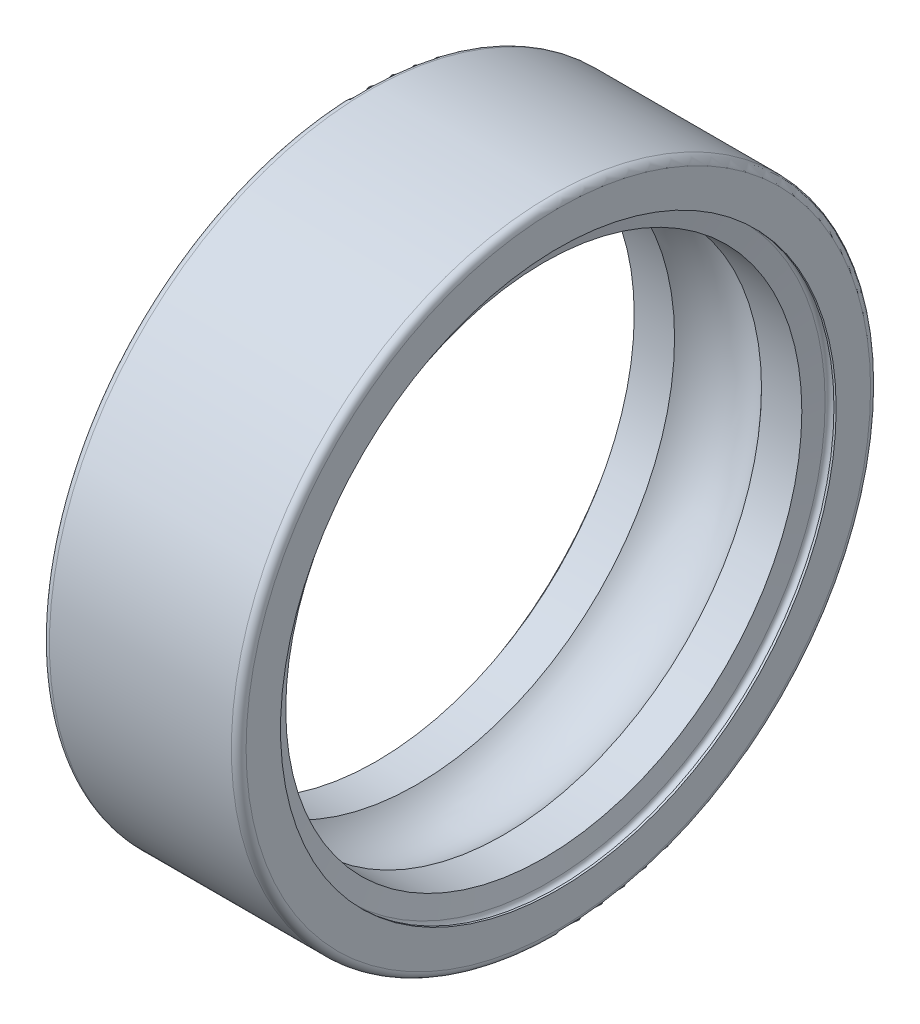
ISO-10303-21;
HEADER;
FILE_DESCRIPTION(('STEP AP214'),'2;1');
FILE_NAME('part.step','',(''),(''),'','','');
FILE_SCHEMA(('AUTOMOTIVE_DESIGN { 1 0 10303 214 1 1 1 1 }'));
ENDSEC;
DATA;
#1=APPLICATION_CONTEXT('core data for automotive mechanical design processes');
#2=APPLICATION_PROTOCOL_DEFINITION('international standard','automotive_design',2000,#1);
#3=PRODUCT_CONTEXT('',#1,'mechanical');
#4=PRODUCT('Part','Part','',(#3));
#5=PRODUCT_RELATED_PRODUCT_CATEGORY('part','',(#4));
#6=PRODUCT_DEFINITION_FORMATION('','',#4);
#7=PRODUCT_DEFINITION_CONTEXT('part definition',#1,'design');
#8=PRODUCT_DEFINITION('design','',#6,#7);
#9=PRODUCT_DEFINITION_SHAPE('','',#8);
#10=(LENGTH_UNIT() NAMED_UNIT(*) SI_UNIT(.MILLI.,.METRE.));
#11=(NAMED_UNIT(*) PLANE_ANGLE_UNIT() SI_UNIT($,.RADIAN.));
#12=(NAMED_UNIT(*) SI_UNIT($,.STERADIAN.) SOLID_ANGLE_UNIT());
#13=UNCERTAINTY_MEASURE_WITH_UNIT(LENGTH_MEASURE(1.E-05),#10,'distance_accuracy_value','');
#14=(GEOMETRIC_REPRESENTATION_CONTEXT(3) GLOBAL_UNCERTAINTY_ASSIGNED_CONTEXT((#13)) GLOBAL_UNIT_ASSIGNED_CONTEXT((#10,
#11,#12)) REPRESENTATION_CONTEXT('',''));
#15=CARTESIAN_POINT('',(0.,0.,0.));
#16=DIRECTION('',(0.,0.,1.));
#17=DIRECTION('',(1.,0.,0.));
#18=AXIS2_PLACEMENT_3D('',#15,#16,#17);
#19=CARTESIAN_POINT('',(0.3,0.,0.));
#20=DIRECTION('',(1.,0.,0.));
#21=DIRECTION('',(0.,0.,-1.));
#22=AXIS2_PLACEMENT_3D('',#19,#20,#21);
#23=TOROIDAL_SURFACE('',#22,12.7,0.3);
#24=CARTESIAN_POINT('',(0.,0.,0.));
#25=DIRECTION('',(1.,0.,0.));
#26=DIRECTION('',(0.,0.,-1.));
#27=AXIS2_PLACEMENT_3D('',#24,#25,#26);
#28=CIRCLE('',#27,12.7);
#29=CARTESIAN_POINT('',(0.,0.,-12.7));
#30=VERTEX_POINT('',#29);
#31=EDGE_CURVE('E10',#30,#30,#28,.T.);
#32=ORIENTED_EDGE('',*,*,#31,.T.);
#33=EDGE_LOOP('',(#32));
#34=FACE_BOUND('',#33,.T.);
#35=CARTESIAN_POINT('',(0.3,0.,0.));
#36=DIRECTION('',(1.,0.,0.));
#37=DIRECTION('',(0.,0.,-1.));
#38=AXIS2_PLACEMENT_3D('',#35,#36,#37);
#39=CIRCLE('',#38,13.);
#40=CARTESIAN_POINT('',(0.3,0.,-13.));
#41=VERTEX_POINT('',#40);
#42=EDGE_CURVE('E60',#41,#41,#39,.T.);
#43=ORIENTED_EDGE('',*,*,#42,.F.);
#44=EDGE_LOOP('',(#43));
#45=FACE_BOUND('',#44,.T.);
#46=ADVANCED_FACE('F14',(#34,#45),#23,.T.);
#47=CARTESIAN_POINT('',(0.,12.7,0.));
#48=DIRECTION('',(-1.,0.,0.));
#49=DIRECTION('',(0.,0.,1.));
#50=AXIS2_PLACEMENT_3D('',#47,#48,#49);
#51=PLANE('',#50);
#52=CARTESIAN_POINT('',(0.,0.,0.));
#53=DIRECTION('',(1.,0.,0.));
#54=DIRECTION('',(0.,0.,-1.));
#55=AXIS2_PLACEMENT_3D('',#52,#53,#54);
#56=CIRCLE('',#55,11.3);
#57=CARTESIAN_POINT('',(0.,0.,-11.3));
#58=VERTEX_POINT('',#57);
#59=EDGE_CURVE('E20',#58,#58,#56,.T.);
#60=ORIENTED_EDGE('',*,*,#59,.T.);
#61=EDGE_LOOP('',(#60));
#62=FACE_BOUND('',#61,.T.);
#63=ORIENTED_EDGE('',*,*,#31,.F.);
#64=EDGE_LOOP('',(#63));
#65=FACE_BOUND('',#64,.T.);
#66=ADVANCED_FACE('F68',(#62,#65),#51,.T.);
#67=CARTESIAN_POINT('',(50.,0.,0.));
#68=DIRECTION('',(1.,0.,0.));
#69=DIRECTION('',(0.,0.,-1.));
#70=AXIS2_PLACEMENT_3D('',#67,#68,#69);
#71=CYLINDRICAL_SURFACE('',#70,11.3);
#72=CARTESIAN_POINT('',(0.09,0.,0.));
#73=DIRECTION('',(1.,0.,0.));
#74=DIRECTION('',(0.,0.,-1.));
#75=AXIS2_PLACEMENT_3D('',#72,#73,#74);
#76=CIRCLE('',#75,11.3);
#77=CARTESIAN_POINT('',(0.09,0.,-11.3));
#78=VERTEX_POINT('',#77);
#79=EDGE_CURVE('E24',#78,#78,#76,.T.);
#80=ORIENTED_EDGE('',*,*,#79,.T.);
#81=EDGE_LOOP('',(#80));
#82=FACE_BOUND('',#81,.T.);
#83=ORIENTED_EDGE('',*,*,#59,.F.);
#84=EDGE_LOOP('',(#83));
#85=FACE_BOUND('',#84,.T.);
#86=ADVANCED_FACE('F73',(#82,#85),#71,.F.);
#87=CARTESIAN_POINT('',(0.27,0.,0.));
#88=DIRECTION('',(1.,0.,0.));
#89=DIRECTION('',(0.,0.,-1.));
#90=AXIS2_PLACEMENT_3D('',#87,#88,#89);
#91=TOROIDAL_SURFACE('',#90,11.3,0.18);
#92=ORIENTED_EDGE('',*,*,#79,.F.);
#93=EDGE_LOOP('',(#92));
#94=FACE_BOUND('',#93,.T.);
#95=CARTESIAN_POINT('',(0.45,0.,0.));
#96=DIRECTION('',(1.,0.,0.));
#97=DIRECTION('',(0.,0.,-1.));
#98=AXIS2_PLACEMENT_3D('',#95,#96,#97);
#99=CIRCLE('',#98,11.3);
#100=CARTESIAN_POINT('',(0.45,0.,-11.3));
#101=VERTEX_POINT('',#100);
#102=EDGE_CURVE('E28',#101,#101,#99,.T.);
#103=ORIENTED_EDGE('',*,*,#102,.T.);
#104=EDGE_LOOP('',(#103));
#105=FACE_BOUND('',#104,.T.);
#106=ADVANCED_FACE('F77',(#94,#105),#91,.F.);
#107=CARTESIAN_POINT('',(0.45,0.,0.));
#108=DIRECTION('',(-1.,0.,0.));
#109=DIRECTION('',(0.,0.,1.));
#110=AXIS2_PLACEMENT_3D('',#107,#108,#109);
#111=CONICAL_SURFACE('',#110,11.3,1.39626340159546);
#112=CARTESIAN_POINT('',(0.591943219470315,0.,0.));
#113=DIRECTION('',(1.,0.,0.));
#114=DIRECTION('',(0.,0.,-1.));
#115=AXIS2_PLACEMENT_3D('',#112,#113,#114);
#116=CIRCLE('',#115,10.495);
#117=CARTESIAN_POINT('',(0.591943219470315,0.,-10.495));
#118=VERTEX_POINT('',#117);
#119=EDGE_CURVE('E33',#118,#118,#116,.T.);
#120=ORIENTED_EDGE('',*,*,#119,.T.);
#121=EDGE_LOOP('',(#120));
#122=FACE_BOUND('',#121,.T.);
#123=ORIENTED_EDGE('',*,*,#102,.F.);
#124=EDGE_LOOP('',(#123));
#125=FACE_BOUND('',#124,.T.);
#126=ADVANCED_FACE('F84',(#122,#125),#111,.F.);
#127=CARTESIAN_POINT('',(50.,0.,0.));
#128=DIRECTION('',(1.,0.,0.));
#129=DIRECTION('',(0.,0.,-1.));
#130=AXIS2_PLACEMENT_3D('',#127,#128,#129);
#131=CYLINDRICAL_SURFACE('',#130,10.495);
#132=CARTESIAN_POINT('',(2.23219458084324,0.,0.));
#133=DIRECTION('',(1.,0.,0.));
#134=DIRECTION('',(0.,0.,-1.));
#135=AXIS2_PLACEMENT_3D('',#132,#133,#134);
#136=CIRCLE('',#135,10.495);
#137=CARTESIAN_POINT('',(2.23219458084324,0.,-10.495));
#138=VERTEX_POINT('',#137);
#139=EDGE_CURVE('E36',#138,#138,#136,.T.);
#140=ORIENTED_EDGE('',*,*,#139,.T.);
#141=EDGE_LOOP('',(#140));
#142=FACE_BOUND('',#141,.T.);
#143=ORIENTED_EDGE('',*,*,#119,.F.);
#144=EDGE_LOOP('',(#143));
#145=FACE_BOUND('',#144,.T.);
#146=ADVANCED_FACE('F88',(#142,#145),#131,.F.);
#147=CARTESIAN_POINT('',(4.,0.,0.));
#148=DIRECTION('',(1.,0.,0.));
#149=DIRECTION('',(0.,0.,-1.));
#150=AXIS2_PLACEMENT_3D('',#147,#148,#149);
#151=TOROIDAL_SURFACE('',#150,8.9,2.381);
#152=ORIENTED_EDGE('',*,*,#139,.F.);
#153=EDGE_LOOP('',(#152));
#154=FACE_BOUND('',#153,.T.);
#155=CARTESIAN_POINT('',(5.76780541915676,0.,0.));
#156=DIRECTION('',(1.,0.,0.));
#157=DIRECTION('',(0.,0.,-1.));
#158=AXIS2_PLACEMENT_3D('',#155,#156,#157);
#159=CIRCLE('',#158,10.495);
#160=CARTESIAN_POINT('',(5.76780541915676,0.,-10.495));
#161=VERTEX_POINT('',#160);
#162=EDGE_CURVE('E39',#161,#161,#159,.T.);
#163=ORIENTED_EDGE('',*,*,#162,.T.);
#164=EDGE_LOOP('',(#163));
#165=FACE_BOUND('',#164,.T.);
#166=ADVANCED_FACE('F92',(#154,#165),#151,.F.);
#167=CARTESIAN_POINT('',(50.,0.,0.));
#168=DIRECTION('',(1.,0.,0.));
#169=DIRECTION('',(0.,0.,-1.));
#170=AXIS2_PLACEMENT_3D('',#167,#168,#169);
#171=CYLINDRICAL_SURFACE('',#170,10.495);
#172=CARTESIAN_POINT('',(7.40805678052969,0.,0.));
#173=DIRECTION('',(1.,0.,0.));
#174=DIRECTION('',(0.,0.,-1.));
#175=AXIS2_PLACEMENT_3D('',#172,#173,#174);
#176=CIRCLE('',#175,10.495);
#177=CARTESIAN_POINT('',(7.40805678052969,0.,-10.495));
#178=VERTEX_POINT('',#177);
#179=EDGE_CURVE('E42',#178,#178,#176,.T.);
#180=ORIENTED_EDGE('',*,*,#179,.T.);
#181=EDGE_LOOP('',(#180));
#182=FACE_BOUND('',#181,.T.);
#183=ORIENTED_EDGE('',*,*,#162,.F.);
#184=EDGE_LOOP('',(#183));
#185=FACE_BOUND('',#184,.T.);
#186=ADVANCED_FACE('F96',(#182,#185),#171,.F.);
#187=CARTESIAN_POINT('',(7.40805678052969,0.,0.));
#188=DIRECTION('',(1.,0.,0.));
#189=DIRECTION('',(0.,0.,-1.));
#190=AXIS2_PLACEMENT_3D('',#187,#188,#189);
#191=CONICAL_SURFACE('',#190,10.495,1.39626340159546);
#192=CARTESIAN_POINT('',(7.55,0.,0.));
#193=DIRECTION('',(1.,0.,0.));
#194=DIRECTION('',(0.,0.,-1.));
#195=AXIS2_PLACEMENT_3D('',#192,#193,#194);
#196=CIRCLE('',#195,11.3);
#197=CARTESIAN_POINT('',(7.55,0.,-11.3));
#198=VERTEX_POINT('',#197);
#199=EDGE_CURVE('E45',#198,#198,#196,.T.);
#200=ORIENTED_EDGE('',*,*,#199,.T.);
#201=EDGE_LOOP('',(#200));
#202=FACE_BOUND('',#201,.T.);
#203=ORIENTED_EDGE('',*,*,#179,.F.);
#204=EDGE_LOOP('',(#203));
#205=FACE_BOUND('',#204,.T.);
#206=ADVANCED_FACE('F100',(#202,#205),#191,.F.);
#207=CARTESIAN_POINT('',(7.73,0.,0.));
#208=DIRECTION('',(1.,0.,0.));
#209=DIRECTION('',(0.,0.,-1.));
#210=AXIS2_PLACEMENT_3D('',#207,#208,#209);
#211=TOROIDAL_SURFACE('',#210,11.3000000094977,0.18);
#212=ORIENTED_EDGE('',*,*,#199,.F.);
#213=EDGE_LOOP('',(#212));
#214=FACE_BOUND('',#213,.T.);
#215=CARTESIAN_POINT('',(7.91,0.,0.));
#216=DIRECTION('',(1.,0.,0.));
#217=DIRECTION('',(0.,0.,-1.));
#218=AXIS2_PLACEMENT_3D('',#215,#216,#217);
#219=CIRCLE('',#218,11.3);
#220=CARTESIAN_POINT('',(7.91,0.,-11.3));
#221=VERTEX_POINT('',#220);
#222=EDGE_CURVE('E48',#221,#221,#219,.T.);
#223=ORIENTED_EDGE('',*,*,#222,.T.);
#224=EDGE_LOOP('',(#223));
#225=FACE_BOUND('',#224,.T.);
#226=ADVANCED_FACE('F104',(#214,#225),#211,.F.);
#227=CARTESIAN_POINT('',(50.,0.,0.));
#228=DIRECTION('',(1.,0.,0.));
#229=DIRECTION('',(0.,0.,-1.));
#230=AXIS2_PLACEMENT_3D('',#227,#228,#229);
#231=CYLINDRICAL_SURFACE('',#230,11.3);
#232=CARTESIAN_POINT('',(8.,0.,0.));
#233=DIRECTION('',(1.,0.,0.));
#234=DIRECTION('',(0.,0.,-1.));
#235=AXIS2_PLACEMENT_3D('',#232,#233,#234);
#236=CIRCLE('',#235,11.3);
#237=CARTESIAN_POINT('',(8.,0.,-11.3));
#238=VERTEX_POINT('',#237);
#239=EDGE_CURVE('E51',#238,#238,#236,.T.);
#240=ORIENTED_EDGE('',*,*,#239,.T.);
#241=EDGE_LOOP('',(#240));
#242=FACE_BOUND('',#241,.T.);
#243=ORIENTED_EDGE('',*,*,#222,.F.);
#244=EDGE_LOOP('',(#243));
#245=FACE_BOUND('',#244,.T.);
#246=ADVANCED_FACE('F108',(#242,#245),#231,.F.);
#247=CARTESIAN_POINT('',(8.,11.3,0.));
#248=DIRECTION('',(1.,0.,0.));
#249=DIRECTION('',(0.,0.,-1.));
#250=AXIS2_PLACEMENT_3D('',#247,#248,#249);
#251=PLANE('',#250);
#252=CARTESIAN_POINT('',(8.,0.,0.));
#253=DIRECTION('',(1.,0.,0.));
#254=DIRECTION('',(0.,0.,-1.));
#255=AXIS2_PLACEMENT_3D('',#252,#253,#254);
#256=CIRCLE('',#255,12.7);
#257=CARTESIAN_POINT('',(8.,0.,-12.7));
#258=VERTEX_POINT('',#257);
#259=EDGE_CURVE('E54',#258,#258,#256,.T.);
#260=ORIENTED_EDGE('',*,*,#259,.T.);
#261=EDGE_LOOP('',(#260));
#262=FACE_BOUND('',#261,.T.);
#263=ORIENTED_EDGE('',*,*,#239,.F.);
#264=EDGE_LOOP('',(#263));
#265=FACE_BOUND('',#264,.T.);
#266=ADVANCED_FACE('F112',(#262,#265),#251,.T.);
#267=CARTESIAN_POINT('',(7.7,0.,0.));
#268=DIRECTION('',(1.,0.,0.));
#269=DIRECTION('',(0.,0.,-1.));
#270=AXIS2_PLACEMENT_3D('',#267,#268,#269);
#271=TOROIDAL_SURFACE('',#270,12.7,0.3);
#272=CARTESIAN_POINT('',(7.7,0.,0.));
#273=DIRECTION('',(1.,0.,0.));
#274=DIRECTION('',(0.,0.,-1.));
#275=AXIS2_PLACEMENT_3D('',#272,#273,#274);
#276=CIRCLE('',#275,13.);
#277=CARTESIAN_POINT('',(7.7,0.,-13.));
#278=VERTEX_POINT('',#277);
#279=EDGE_CURVE('E57',#278,#278,#276,.T.);
#280=ORIENTED_EDGE('',*,*,#279,.T.);
#281=EDGE_LOOP('',(#280));
#282=FACE_BOUND('',#281,.T.);
#283=ORIENTED_EDGE('',*,*,#259,.F.);
#284=EDGE_LOOP('',(#283));
#285=FACE_BOUND('',#284,.T.);
#286=ADVANCED_FACE('F116',(#282,#285),#271,.T.);
#287=CARTESIAN_POINT('',(50.,0.,0.));
#288=DIRECTION('',(1.,0.,0.));
#289=DIRECTION('',(0.,0.,-1.));
#290=AXIS2_PLACEMENT_3D('',#287,#288,#289);
#291=CYLINDRICAL_SURFACE('',#290,13.);
#292=ORIENTED_EDGE('',*,*,#42,.T.);
#293=EDGE_LOOP('',(#292));
#294=FACE_BOUND('',#293,.T.);
#295=ORIENTED_EDGE('',*,*,#279,.F.);
#296=EDGE_LOOP('',(#295));
#297=FACE_BOUND('',#296,.T.);
#298=ADVANCED_FACE('F64',(#294,#297),#291,.T.);
#299=CLOSED_SHELL('',(#46,#66,#86,#106,#126,#146,#166,#186,#206,#226,#246,#266,#286,#298));
#300=MANIFOLD_SOLID_BREP('B1',#299);
#301=ADVANCED_BREP_SHAPE_REPRESENTATION('',(#18,#300),#14);
#302=SHAPE_DEFINITION_REPRESENTATION(#9,#301);
ENDSEC;
END-ISO-10303-21;
